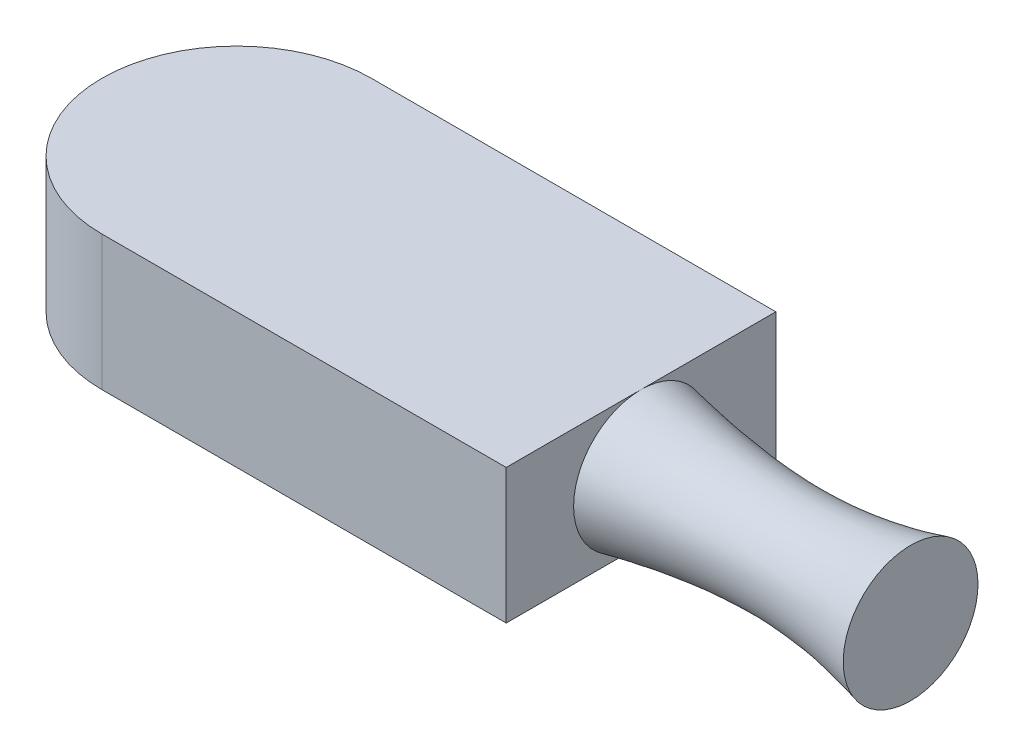
ISO-10303-21;
HEADER;
FILE_DESCRIPTION(('STEP AP214'),'2;1');
FILE_NAME('part.step','',(''),(''),'','','');
FILE_SCHEMA(('AUTOMOTIVE_DESIGN { 1 0 10303 214 1 1 1 1 }'));
ENDSEC;
DATA;
#1=APPLICATION_CONTEXT('core data for automotive mechanical design processes');
#2=APPLICATION_PROTOCOL_DEFINITION('international standard','automotive_design',2000,#1);
#3=PRODUCT_CONTEXT('',#1,'mechanical');
#4=PRODUCT('Part','Part','',(#3));
#5=PRODUCT_RELATED_PRODUCT_CATEGORY('part','',(#4));
#6=PRODUCT_DEFINITION_FORMATION('','',#4);
#7=PRODUCT_DEFINITION_CONTEXT('part definition',#1,'design');
#8=PRODUCT_DEFINITION('design','',#6,#7);
#9=PRODUCT_DEFINITION_SHAPE('','',#8);
#10=(LENGTH_UNIT() NAMED_UNIT(*) SI_UNIT(.MILLI.,.METRE.));
#11=(NAMED_UNIT(*) PLANE_ANGLE_UNIT() SI_UNIT($,.RADIAN.));
#12=(NAMED_UNIT(*) SI_UNIT($,.STERADIAN.) SOLID_ANGLE_UNIT());
#13=UNCERTAINTY_MEASURE_WITH_UNIT(LENGTH_MEASURE(1.E-05),#10,'distance_accuracy_value','');
#14=(GEOMETRIC_REPRESENTATION_CONTEXT(3) GLOBAL_UNCERTAINTY_ASSIGNED_CONTEXT((#13)) GLOBAL_UNIT_ASSIGNED_CONTEXT((#10,
#11,#12)) REPRESENTATION_CONTEXT('',''));
#15=CARTESIAN_POINT('',(0.,0.,0.));
#16=DIRECTION('',(0.,0.,1.));
#17=DIRECTION('',(1.,0.,0.));
#18=AXIS2_PLACEMENT_3D('',#15,#16,#17);
#19=CARTESIAN_POINT('',(38.1,25.4,0.));
#20=DIRECTION('',(-1.,0.,0.));
#21=DIRECTION('',(0.,0.,1.));
#22=AXIS2_PLACEMENT_3D('',#19,#20,#21);
#23=PLANE('',#22);
#24=DIRECTION('',(0.,0.,-1.));
#25=VECTOR('',#24,1.);
#26=CARTESIAN_POINT('',(38.1,0.,0.));
#27=LINE('',#26,#25);
#28=CARTESIAN_POINT('',(38.1,0.,25.4));
#29=VERTEX_POINT('',#28);
#30=CARTESIAN_POINT('',(38.1,0.000164924090044047,0.000815728203316317));
#31=VERTEX_POINT('',#30);
#32=EDGE_CURVE('E153',#29,#31,#27,.T.);
#33=ORIENTED_EDGE('',*,*,#32,.T.);
#34=CARTESIAN_POINT('',(38.1,12.7,0.));
#35=DIRECTION('',(1.,0.,0.));
#36=DIRECTION('',(0.,0.,-1.));
#37=AXIS2_PLACEMENT_3D('',#34,#35,#36);
#38=CIRCLE('',#37,12.7);
#39=CARTESIAN_POINT('',(38.1,25.3998352260934,-0.000815726641127512));
#40=VERTEX_POINT('',#39);
#41=EDGE_CURVE('E101',#40,#31,#38,.T.);
#42=ORIENTED_EDGE('',*,*,#41,.F.);
#43=DIRECTION('',(0.,0.,-1.));
#44=VECTOR('',#43,1.);
#45=CARTESIAN_POINT('',(38.1,25.4,0.));
#46=LINE('',#45,#44);
#47=CARTESIAN_POINT('',(38.1,25.4,25.4));
#48=VERTEX_POINT('',#47);
#49=EDGE_CURVE('E151',#48,#40,#46,.T.);
#50=ORIENTED_EDGE('',*,*,#49,.F.);
#51=DIRECTION('',(0.,-1.,0.));
#52=VECTOR('',#51,1.);
#53=CARTESIAN_POINT('',(38.1,25.4,25.4));
#54=LINE('',#53,#52);
#55=EDGE_CURVE('E194',#48,#29,#54,.T.);
#56=ORIENTED_EDGE('',*,*,#55,.T.);
#57=EDGE_LOOP('',(#33,#42,#50,#56));
#58=FACE_BOUND('',#57,.T.);
#59=ADVANCED_FACE('F81',(#58),#23,.F.);
#60=CARTESIAN_POINT('',(-38.1,25.4,0.));
#61=DIRECTION('',(0.,-1.,0.));
#62=DIRECTION('',(0.,0.,-1.));
#63=AXIS2_PLACEMENT_3D('',#60,#61,#62);
#64=CYLINDRICAL_SURFACE('',#63,25.4);
#65=CARTESIAN_POINT('',(-38.1,0.,0.));
#66=DIRECTION('',(0.,1.,0.));
#67=DIRECTION('',(0.,0.,1.));
#68=AXIS2_PLACEMENT_3D('',#65,#66,#67);
#69=CIRCLE('',#68,25.4);
#70=CARTESIAN_POINT('',(-38.1,0.,-25.4));
#71=VERTEX_POINT('',#70);
#72=CARTESIAN_POINT('',(-38.1,0.,25.4));
#73=VERTEX_POINT('',#72);
#74=EDGE_CURVE('E178',#71,#73,#69,.T.);
#75=ORIENTED_EDGE('',*,*,#74,.T.);
#76=DIRECTION('',(0.,-1.,0.));
#77=VECTOR('',#76,1.);
#78=CARTESIAN_POINT('',(-38.1,25.4,25.4));
#79=LINE('',#78,#77);
#80=CARTESIAN_POINT('',(-38.1,25.4,25.4));
#81=VERTEX_POINT('',#80);
#82=EDGE_CURVE('E95',#81,#73,#79,.T.);
#83=ORIENTED_EDGE('',*,*,#82,.F.);
#84=CARTESIAN_POINT('',(-38.1,25.4,0.));
#85=DIRECTION('',(0.,1.,0.));
#86=DIRECTION('',(0.,0.,1.));
#87=AXIS2_PLACEMENT_3D('',#84,#85,#86);
#88=CIRCLE('',#87,25.4);
#89=CARTESIAN_POINT('',(-38.1,25.4,-25.4));
#90=VERTEX_POINT('',#89);
#91=EDGE_CURVE('E191',#90,#81,#88,.T.);
#92=ORIENTED_EDGE('',*,*,#91,.F.);
#93=DIRECTION('',(0.,-1.,0.));
#94=VECTOR('',#93,1.);
#95=CARTESIAN_POINT('',(-38.1,25.4,-25.4));
#96=LINE('',#95,#94);
#97=EDGE_CURVE('E110',#90,#71,#96,.T.);
#98=ORIENTED_EDGE('',*,*,#97,.T.);
#99=EDGE_LOOP('',(#75,#83,#92,#98));
#100=FACE_BOUND('',#99,.T.);
#101=ADVANCED_FACE('F83',(#100),#64,.T.);
#102=CARTESIAN_POINT('',(0.,25.4,25.4));
#103=DIRECTION('',(0.,0.,-1.));
#104=DIRECTION('',(-1.,0.,0.));
#105=AXIS2_PLACEMENT_3D('',#102,#103,#104);
#106=PLANE('',#105);
#107=DIRECTION('',(1.,0.,0.));
#108=VECTOR('',#107,1.);
#109=CARTESIAN_POINT('',(0.,0.,25.4));
#110=LINE('',#109,#108);
#111=EDGE_CURVE('E180',#73,#29,#110,.T.);
#112=ORIENTED_EDGE('',*,*,#111,.T.);
#113=ORIENTED_EDGE('',*,*,#55,.F.);
#114=DIRECTION('',(1.,0.,0.));
#115=VECTOR('',#114,1.);
#116=CARTESIAN_POINT('',(0.,25.4,25.4));
#117=LINE('',#116,#115);
#118=EDGE_CURVE('E137',#81,#48,#117,.T.);
#119=ORIENTED_EDGE('',*,*,#118,.F.);
#120=ORIENTED_EDGE('',*,*,#82,.T.);
#121=EDGE_LOOP('',(#112,#113,#119,#120));
#122=FACE_BOUND('',#121,.T.);
#123=ADVANCED_FACE('F199',(#122),#106,.F.);
#124=CARTESIAN_POINT('',(38.1,25.4,-25.4));
#125=VERTEX_POINT('',#124);
#126=EDGE_CURVE('E158',#40,#125,#46,.T.);
#127=ORIENTED_EDGE('',*,*,#126,.F.);
#128=CARTESIAN_POINT('',(38.0999999999999,25.3996704428553,-0.000815674937197479));
#129=CARTESIAN_POINT('',(38.1,25.3996066486588,-0.202913376100319));
#130=CARTESIAN_POINT('',(38.1,25.3947481057519,-0.405009517367538));
#131=CARTESIAN_POINT('',(38.1,25.3754574167251,-0.808751665281319));
#132=CARTESIAN_POINT('',(38.1,25.361024923713,-1.01039765535195));
#133=CARTESIAN_POINT('',(38.1,25.3226037702186,-1.41276170348465));
#134=CARTESIAN_POINT('',(38.1,25.298615873159,-1.61347983438177));
#135=CARTESIAN_POINT('',(38.1,25.2411012493836,-2.01354080108224));
#136=CARTESIAN_POINT('',(38.1,25.2075746812541,-2.21288365969394));
#137=CARTESIAN_POINT('',(38.1,25.1310680678409,-2.60934790581265));
#138=CARTESIAN_POINT('',(38.1,25.088106694036,-2.80647288369062));
#139=CARTESIAN_POINT('',(38.1,24.9927340025499,-3.19840569838486));
#140=CARTESIAN_POINT('',(38.1,24.940322593387,-3.39321351275022));
#141=CARTESIAN_POINT('',(38.1,24.769221088842,-3.97348757581742));
#142=CARTESIAN_POINT('',(38.1,24.6366328501715,-4.35496381855234));
#143=CARTESIAN_POINT('',(38.1,24.353249994578,-5.06067306140083));
#144=CARTESIAN_POINT('',(38.1,24.2062795417913,-5.38645837692749));
#145=CARTESIAN_POINT('',(38.1,23.8855897684626,-6.02458102020995));
#146=CARTESIAN_POINT('',(38.1,23.7118731469682,-6.33691970084663));
#147=CARTESIAN_POINT('',(38.1,23.3387760659615,-6.94572018129846));
#148=CARTESIAN_POINT('',(38.1,23.1394051144208,-7.2421878058666));
#149=CARTESIAN_POINT('',(38.1,22.7160929284025,-7.81703614059032));
#150=CARTESIAN_POINT('',(38.1000000000001,22.4921513016699,-8.09541656188223));
#151=CARTESIAN_POINT('',(38.1000000000001,22.0218789588709,-8.63209895757966));
#152=CARTESIAN_POINT('',(38.1,21.7755695207335,-8.89041958916134));
#153=CARTESIAN_POINT('',(38.1,21.2622312470849,-9.38557714913558));
#154=CARTESIAN_POINT('',(38.1,20.9952018093197,-9.62241345262358));
#155=CARTESIAN_POINT('',(38.1,20.4421417911485,-10.0729990995825));
#156=CARTESIAN_POINT('',(38.1,20.1561060460419,-10.2867421259988));
#157=CARTESIAN_POINT('',(38.1,19.7143653654544,-10.5886212538229));
#158=CARTESIAN_POINT('',(38.1,19.5649910925558,-10.6861323451511));
#159=CARTESIAN_POINT('',(38.1,19.2622249541605,-10.874703884932));
#160=CARTESIAN_POINT('',(38.1,19.1088330922936,-10.9657643392127));
#161=CARTESIAN_POINT('',(38.1,18.6425201484366,-11.2293893038699));
#162=CARTESIAN_POINT('',(38.1,18.3239392739334,-11.3920712460135));
#163=CARTESIAN_POINT('',(38.1,17.6742710345171,-11.690120888392));
#164=CARTESIAN_POINT('',(38.1,17.3431825995161,-11.8254862452367));
#165=CARTESIAN_POINT('',(38.1,16.6708536303209,-12.0680152339755));
#166=CARTESIAN_POINT('',(38.1,16.3296140146357,-12.1751814088285));
#167=CARTESIAN_POINT('',(38.1,15.6393572356093,-12.3604381178517));
#168=CARTESIAN_POINT('',(38.1000000000001,15.2903407949923,-12.4385313420153));
#169=CARTESIAN_POINT('',(38.1000000000001,14.5865419011062,-12.5647147886061));
#170=CARTESIAN_POINT('',(38.1,14.2317537750473,-12.6127734022006));
#171=CARTESIAN_POINT('',(38.1,13.519364931522,-12.6786792623036));
#172=CARTESIAN_POINT('',(38.1,13.1617639826887,-12.6965239969224));
#173=CARTESIAN_POINT('',(38.1,12.4463240497424,-12.7021571734447));
#174=CARTESIAN_POINT('',(38.1,12.0884850621326,-12.6899451636185));
#175=CARTESIAN_POINT('',(38.1,11.3751078163937,-12.6355618336902));
#176=CARTESIAN_POINT('',(38.1,11.0195694329149,-12.5933921599556));
#177=CARTESIAN_POINT('',(38.1,10.313741785242,-12.4792256287415));
#178=CARTESIAN_POINT('',(38.1,9.96344671587475,-12.4072647485973));
#179=CARTESIAN_POINT('',(38.1,9.27026931102974,-12.2337240385799));
#180=CARTESIAN_POINT('',(38.1,8.92738709288603,-12.1321437402452));
#181=CARTESIAN_POINT('',(38.1,8.2514041768775,-11.9005198242328));
#182=CARTESIAN_POINT('',(38.1,7.9183029661525,-11.7704777019643));
#183=CARTESIAN_POINT('',(38.1,7.26415645901603,-11.4829735142019));
#184=CARTESIAN_POINT('',(38.1,6.94311143814598,-11.3255108224804));
#185=CARTESIAN_POINT('',(38.1,6.31555172425616,-10.9843034601806));
#186=CARTESIAN_POINT('',(38.1,6.00902647867663,-10.8005782790713));
#187=CARTESIAN_POINT('',(38.1,5.56180434717338,-10.5060824385823));
#188=CARTESIAN_POINT('',(38.1,5.41481278056378,-10.4047565134222));
#189=CARTESIAN_POINT('',(38.1,5.12528945069728,-10.1959217370406));
#190=CARTESIAN_POINT('',(38.1,4.98275768577455,-10.0884128881287));
#191=CARTESIAN_POINT('',(38.1,4.56224303688711,-9.75700095248963));
#192=CARTESIAN_POINT('',(38.1,4.29123679912454,-9.52414392755239));
#193=CARTESIAN_POINT('',(38.1,3.76971620348353,-9.03654728761646));
#194=CARTESIAN_POINT('',(38.1,3.51920350189633,-8.78180590732458));
#195=CARTESIAN_POINT('',(38.1,3.04059557799481,-8.25252936784889));
#196=CARTESIAN_POINT('',(38.1,2.81247762652498,-7.97801477831407));
#197=CARTESIAN_POINT('',(38.1,2.38009027900863,-7.41083168384099));
#198=CARTESIAN_POINT('',(38.1,2.17581891968809,-7.11816467642142));
#199=CARTESIAN_POINT('',(38.1,1.79283265684639,-6.51634682237808));
#200=CARTESIAN_POINT('',(38.1,1.61413081291858,-6.20718766228811));
#201=CARTESIAN_POINT('',(38.1,1.28344175522118,-5.57489391880717));
#202=CARTESIAN_POINT('',(38.1000000000001,1.13145566219974,-5.25175874981915));
#203=CARTESIAN_POINT('',(38.1000000000001,0.854960667297845,-4.59372238519691));
#204=CARTESIAN_POINT('',(38.1,0.73046780841875,-4.25881445127334));
#205=CARTESIAN_POINT('',(38.1,0.509930583704949,-3.57971315856796));
#206=CARTESIAN_POINT('',(38.1,0.41388916740969,-3.23551884110664));
#207=CARTESIAN_POINT('',(38.1,0.2513436415092,-2.54089044598912));
#208=CARTESIAN_POINT('',(38.1,0.184786093552212,-2.19046886444152));
#209=CARTESIAN_POINT('',(38.1,0.081759670512506,-1.48538170587364));
#210=CARTESIAN_POINT('',(38.1,0.045273318702744,-1.13071871564286));
#211=CARTESIAN_POINT('',(38.1,0.0158703964262496,-0.645994130726347));
#212=CARTESIAN_POINT('',(38.1,0.0100029165092976,-0.51661638050932));
#213=CARTESIAN_POINT('',(38.1,0.00221524772106838,-0.257891935829001));
#214=CARTESIAN_POINT('',(38.1,0.000290499159893829,-0.128545378661662));
#215=CARTESIAN_POINT('',(38.1,0.00032985751240655,0.000815677812366548));
#216=B_SPLINE_CURVE_WITH_KNOTS('',3,(#128,#129,#130,#131,#132,#133,#134,#135,#136,#137,#138,
#139,#140,#141,#142,#143,#144,#145,#146,#147,#148,#149,#150,#151,#152,#153,#154,#155,#156,#157,
#158,#159,#160,#161,#162,#163,#164,#165,#166,#167,#168,#169,#170,#171,#172,#173,#174,#175,#176,
#177,#178,#179,#180,#181,#182,#183,#184,#185,#186,#187,#188,#189,#190,#191,#192,#193,#194,#195,
#196,#197,#198,#199,#200,#201,#202,#203,#204,#205,#206,#207,#208,#209,#210,#211,#212,#213,#214,
#215),.UNSPECIFIED.,.F.,.F.,(4,2,2,2,2,2,2,2,2,2,2,2,2,2,2,2,2,2,2,2,2,2,2,2,2,2,2,2,2,2,2,2,2,
2,2,2,2,2,2,2,2,2,2,4),(0.,0.606236308706906,1.21249458432875,1.81870443305675,2.42490420375325,
3.02991494581151,3.63493154502775,4.8444797160082,5.91550302414146,6.98641832239348,
8.05693785658072,9.12747448341772,10.1970031955846,11.2665630066619,12.3364146538525,
12.8714289132123,13.4064426892013,14.4781995388123,15.5500482914833,16.6218003533279,
17.6934532259692,18.7662320297928,19.8391000167911,20.9119841282641,21.9848092823691,
23.056342601703,24.1278928693587,25.199386850339,26.2709053051797,27.3416326719611,
27.8770862650645,28.4125396581633,29.4830739892486,30.5536947558071,31.6232174305619,
32.6926519900382,33.7626308267249,34.8326545392141,35.9033009975636,36.9740584102078,
38.0428670964111,39.1110541752863,39.4995416605508,39.8875796135859),.UNSPECIFIED.);
#217=EDGE_CURVE('E12',#40,#31,#216,.T.);
#218=ORIENTED_EDGE('',*,*,#217,.T.);
#219=CARTESIAN_POINT('',(38.1,0.,-25.4));
#220=VERTEX_POINT('',#219);
#221=EDGE_CURVE('E182',#31,#220,#27,.T.);
#222=ORIENTED_EDGE('',*,*,#221,.T.);
#223=DIRECTION('',(0.,-1.,0.));
#224=VECTOR('',#223,1.);
#225=CARTESIAN_POINT('',(38.1,25.4,-25.4));
#226=LINE('',#225,#224);
#227=EDGE_CURVE('E161',#125,#220,#226,.T.);
#228=ORIENTED_EDGE('',*,*,#227,.F.);
#229=EDGE_LOOP('',(#127,#218,#222,#228));
#230=FACE_BOUND('',#229,.T.);
#231=ADVANCED_FACE('F159',(#230),#23,.F.);
#232=CARTESIAN_POINT('',(0.,25.4,-25.4));
#233=DIRECTION('',(0.,0.,-1.));
#234=DIRECTION('',(-1.,0.,0.));
#235=AXIS2_PLACEMENT_3D('',#232,#233,#234);
#236=PLANE('',#235);
#237=DIRECTION('',(1.,0.,0.));
#238=VECTOR('',#237,1.);
#239=CARTESIAN_POINT('',(0.,0.,-25.4));
#240=LINE('',#239,#238);
#241=EDGE_CURVE('E185',#71,#220,#240,.T.);
#242=ORIENTED_EDGE('',*,*,#241,.F.);
#243=ORIENTED_EDGE('',*,*,#97,.F.);
#244=DIRECTION('',(1.,0.,0.));
#245=VECTOR('',#244,1.);
#246=CARTESIAN_POINT('',(0.,25.4,-25.4));
#247=LINE('',#246,#245);
#248=EDGE_CURVE('E166',#90,#125,#247,.T.);
#249=ORIENTED_EDGE('',*,*,#248,.T.);
#250=ORIENTED_EDGE('',*,*,#227,.T.);
#251=EDGE_LOOP('',(#242,#243,#249,#250));
#252=FACE_BOUND('',#251,.T.);
#253=ADVANCED_FACE('F193',(#252),#236,.T.);
#254=CARTESIAN_POINT('',(0.,25.4,0.));
#255=DIRECTION('',(0.,1.,0.));
#256=DIRECTION('',(0.,0.,1.));
#257=AXIS2_PLACEMENT_3D('',#254,#255,#256);
#258=PLANE('',#257);
#259=ORIENTED_EDGE('',*,*,#91,.T.);
#260=ORIENTED_EDGE('',*,*,#118,.T.);
#261=ORIENTED_EDGE('',*,*,#49,.T.);
#262=ORIENTED_EDGE('',*,*,#126,.T.);
#263=ORIENTED_EDGE('',*,*,#248,.F.);
#264=EDGE_LOOP('',(#259,#260,#261,#262,#263));
#265=FACE_BOUND('',#264,.T.);
#266=ADVANCED_FACE('F165',(#265),#258,.T.);
#267=CARTESIAN_POINT('',(0.,0.,0.));
#268=DIRECTION('',(0.,1.,0.));
#269=DIRECTION('',(0.,0.,1.));
#270=AXIS2_PLACEMENT_3D('',#267,#268,#269);
#271=PLANE('',#270);
#272=ORIENTED_EDGE('',*,*,#74,.F.);
#273=ORIENTED_EDGE('',*,*,#241,.T.);
#274=ORIENTED_EDGE('',*,*,#221,.F.);
#275=ORIENTED_EDGE('',*,*,#32,.F.);
#276=ORIENTED_EDGE('',*,*,#111,.F.);
#277=EDGE_LOOP('',(#272,#273,#274,#275,#276));
#278=FACE_BOUND('',#277,.T.);
#279=ADVANCED_FACE('F196',(#278),#271,.F.);
#280=CARTESIAN_POINT('',(88.9,12.7,0.));
#281=DIRECTION('',(1.,0.,0.));
#282=DIRECTION('',(0.,0.,-1.));
#283=AXIS2_PLACEMENT_3D('',#280,#281,#282);
#284=PLANE('',#283);
#285=CARTESIAN_POINT('',(88.9,12.7,0.));
#286=DIRECTION('',(1.,0.,0.));
#287=DIRECTION('',(0.,0.,-1.));
#288=AXIS2_PLACEMENT_3D('',#285,#286,#287);
#289=CIRCLE('',#288,12.7);
#290=CARTESIAN_POINT('',(88.9,12.7,-12.7));
#291=VERTEX_POINT('',#290);
#292=EDGE_CURVE('E154',#291,#291,#289,.T.);
#293=ORIENTED_EDGE('',*,*,#292,.T.);
#294=EDGE_LOOP('',(#293));
#295=FACE_BOUND('',#294,.T.);
#296=ADVANCED_FACE('F215',(#295),#284,.T.);
#297=CARTESIAN_POINT('',(38.1,19.3561312695833,-10.8160027978027));
#298=CARTESIAN_POINT('',(46.6275733472348,18.117911659557,-9.5170545116901));
#299=CARTESIAN_POINT('',(63.6806582867568,15.2209304345255,-8.46421797816333));
#300=CARTESIAN_POINT('',(80.4942400139015,11.5285766471072,-10.4950189467063));
#301=CARTESIAN_POINT('',(88.9,9.47212875090853,-12.282949450327));
#302=CARTESIAN_POINT('',(38.1,20.7719426393336,-9.94471730479775));
#303=CARTESIAN_POINT('',(46.6275716404865,19.3636946098074,-8.80783986620953));
#304=CARTESIAN_POINT('',(63.6806599936789,16.3288874908063,-8.13422104371846));
#305=CARTESIAN_POINT('',(80.4942383071531,12.9023807495492,-10.6483860376017));
#306=CARTESIAN_POINT('',(88.9,11.0799629768181,-12.7054767832048));
#307=CARTESIAN_POINT('',(38.1000000000001,23.2569088305093,-7.63985575065806));
#308=CARTESIAN_POINT('',(46.6275751791548,21.5730169473672,-6.89472562063252));
#309=CARTESIAN_POINT('',(63.6806564546503,18.4132846408225,-7.03422372455075));
#310=CARTESIAN_POINT('',(80.4942418458214,15.7104130069792,-10.4091545383922));
#311=CARTESIAN_POINT('',(88.9,14.4630070374963,-12.9115268706798));
#312=CARTESIAN_POINT('',(38.1,25.3766928887343,-3.01801063603366));
#313=CARTESIAN_POINT('',(46.6275793635323,23.5358805124229,-2.97392204926547));
#314=CARTESIAN_POINT('',(63.6806522698473,20.670154175395,-4.31189690803263));
#315=CARTESIAN_POINT('',(80.4942460301989,19.4646842847993,-8.46431592787116));
#316=CARTESIAN_POINT('',(88.9,19.2698974439998,-11.2535940201263));
#317=CARTESIAN_POINT('',(38.1,25.5668047197692,2.0626916075049));
#318=CARTESIAN_POINT('',(46.6275775010547,23.849253237563,1.39895000366513));
#319=CARTESIAN_POINT('',(63.6806541325143,21.7136685286558,-0.933872811125934));
#320=CARTESIAN_POINT('',(80.4942441677212,22.1889207305993,-5.23150719738819));
#321=CARTESIAN_POINT('',(88.8999999999999,23.0763062549513,-7.88299618595653));
#322=CARTESIAN_POINT('',(38.1000000000001,23.7979524174008,6.829690380475));
#323=CARTESIAN_POINT('',(46.6275772255515,22.4651373618147,5.55918395963246));
#324=CARTESIAN_POINT('',(63.6806544080452,21.384855158609,2.58667534685951));
#325=CARTESIAN_POINT('',(80.4942438922184,23.4686185312177,-1.20193097259306));
#326=CARTESIAN_POINT('',(88.9000000000001,25.303174092294,-3.31198148415341));
#327=CARTESIAN_POINT('',(38.1,20.3396013810419,10.5567655261092));
#328=CARTESIAN_POINT('',(46.6275777738006,19.594450108751,8.87294481997831));
#329=CARTESIAN_POINT('',(63.6806538597405,19.7339285609122,5.71331718547144));
#330=CARTESIAN_POINT('',(80.4942444404673,23.1088808900919,3.01049595646686));
#331=CARTESIAN_POINT('',(88.9,25.6112475742705,1.76309208788405));
#332=CARTESIAN_POINT('',(38.1,15.7181469225478,12.6767408843745));
#333=CARTESIAN_POINT('',(46.6275740350567,15.674097839878,10.8358826667399));
#334=CARTESIAN_POINT('',(63.6806575988651,17.012111682574,7.97009118526161));
#335=CARTESIAN_POINT('',(80.4942407017234,21.1644817891664,6.76461005221826));
#336=CARTESIAN_POINT('',(88.9,23.9537228408224,6.56983200071407));
#337=CARTESIAN_POINT('',(38.1,10.6372790307642,12.8668145581128));
#338=CARTESIAN_POINT('',(46.6275806765461,11.3009912397407,11.149261127405));
#339=CARTESIAN_POINT('',(63.6806509566994,13.6337861483659,9.01367794513035));
#340=CARTESIAN_POINT('',(80.4942473432127,17.9314605708924,9.48894095302297));
#341=CARTESIAN_POINT('',(88.8999999999999,20.5829830289063,10.3763342870093));
#342=CARTESIAN_POINT('',(38.0999999999999,5.87036902690964,11.0979343286796));
#343=CARTESIAN_POINT('',(46.6275769170244,7.14086575644728,9.76512454294644));
#344=CARTESIAN_POINT('',(63.6806547166043,10.1133595375184,8.68484092649118));
#345=CARTESIAN_POINT('',(80.4942435836913,13.9019593512727,10.7685807437713));
#346=CARTESIAN_POINT('',(88.9000000000002,16.0120094191477,12.6031186299168));
#347=CARTESIAN_POINT('',(38.1000000000001,2.1431645737867,7.63956546235698));
#348=CARTESIAN_POINT('',(46.6275746816077,3.82702376344748,6.8944335572862));
#349=CARTESIAN_POINT('',(63.6806569522479,6.98669048836395,7.03394305209315));
#350=CARTESIAN_POINT('',(80.4942413482743,9.68946982567314,10.4089054664496));
#351=CARTESIAN_POINT('',(88.8999999999999,10.9368336657107,12.9112733356327));
#352=CARTESIAN_POINT('',(38.0999999999999,0.0232628762407011,3.0181627177405));
#353=CARTESIAN_POINT('',(46.6275800366887,1.86409122214814,2.97406097577792));
#354=CARTESIAN_POINT('',(63.6806515966223,4.72985245249984,4.31201802255888));
#355=CARTESIAN_POINT('',(80.4942467033555,5.93537064848787,8.46443987390692));
#356=CARTESIAN_POINT('',(88.9000000000001,6.13018202140825,11.2537310268119));
#357=CARTESIAN_POINT('',(38.1000000000001,-0.166768343447337,-2.06278453322843));
#358=CARTESIAN_POINT('',(46.6275772666563,1.55077327654869,-1.39903272089718));
#359=CARTESIAN_POINT('',(63.6806543669365,3.68633544332709,0.933801291477284));
#360=CARTESIAN_POINT('',(80.4942439333229,3.21105328234284,5.23142734583147));
#361=CARTESIAN_POINT('',(88.8999999999999,2.32365164402659,7.88290570982255));
#362=CARTESIAN_POINT('',(38.1,1.60200448636447,-6.82962035045663));
#363=CARTESIAN_POINT('',(46.6275771885381,2.93482751425458,-5.55912205218535));
#364=CARTESIAN_POINT('',(63.6806544450628,4.01512834749155,-2.58661997958567));
#365=CARTESIAN_POINT('',(80.4942438552046,1.93138900860283,1.20199921203439));
#366=CARTESIAN_POINT('',(88.8999999999999,0.0968468070980687,3.31206101216312));
#367=CARTESIAN_POINT('',(38.1,5.06046518263925,-10.5568398746348));
#368=CARTESIAN_POINT('',(46.6275781680307,5.80560737701356,-8.87301055783899));
#369=CARTESIAN_POINT('',(63.6806534654704,5.66610720318157,-5.71337907049595));
#370=CARTESIAN_POINT('',(80.4942448346976,2.29112718987278,-3.01057968465376));
#371=CARTESIAN_POINT('',(88.9000000000003,-0.211255393699501,-1.76319157297547));
#372=CARTESIAN_POINT('',(38.1,9.6817372458868,-12.6766328629346));
#373=CARTESIAN_POINT('',(46.627572757534,9.72579866538946,-10.8357855574454));
#374=CARTESIAN_POINT('',(63.6806588765175,8.3878170937145,-7.96999450069305));
#375=CARTESIAN_POINT('',(80.4942394242006,4.23548997765933,-6.76447444436629));
#376=CARTESIAN_POINT('',(88.8999999999997,1.44627531759073,-6.56967362713185));
#377=CARTESIAN_POINT('',(38.1,14.7629470349457,-12.8670108990999));
#378=CARTESIAN_POINT('',(46.6275854196451,14.0992256688031,-11.1494556839281));
#379=CARTESIAN_POINT('',(63.6806462131183,11.7663829829374,-9.0138955827034));
#380=CARTESIAN_POINT('',(80.4942520863118,7.46861775107832,-9.48922250113599));
#381=CARTESIAN_POINT('',(88.9000000000001,4.81703104078962,-10.3766333815296));
#382=CARTESIAN_POINT('',(38.1,17.9403198998329,-11.6872882908077));
#383=CARTESIAN_POINT('',(46.6275750539832,16.8721287093066,-10.2262691571707));
#384=CARTESIAN_POINT('',(63.6806565798347,14.1129733782447,-8.79421491260821));
#385=CARTESIAN_POINT('',(80.4942417206499,10.1547725446652,-10.3416518558109));
#386=CARTESIAN_POINT('',(88.9,7.86429452499891,-11.8604221174493));
#387=CARTESIAN_POINT('',(38.1,19.3561312695833,-10.8160027978027));
#388=CARTESIAN_POINT('',(46.6275733472348,18.117911659557,-9.5170545116901));
#389=CARTESIAN_POINT('',(63.6806582867568,15.2209304345255,-8.46421797816333));
#390=CARTESIAN_POINT('',(80.4942400139015,11.5285766471072,-10.4950189467063));
#391=CARTESIAN_POINT('',(88.9,9.47212875090853,-12.282949450327));
#392=B_SPLINE_SURFACE_WITH_KNOTS('',3,3,((#297,#298,#299,#300,#301),(#302,#303,#304,#305,#306),
(#307,#308,#309,#310,#311),(#312,#313,#314,#315,#316),(#317,#318,#319,#320,#321),(#322,#323,
#324,#325,#326),(#327,#328,#329,#330,#331),(#332,#333,#334,#335,#336),(#337,#338,#339,#340,
#341),(#342,#343,#344,#345,#346),(#347,#348,#349,#350,#351),(#352,#353,#354,#355,#356),(#357,
#358,#359,#360,#361),(#362,#363,#364,#365,#366),(#367,#368,#369,#370,#371),(#372,#373,#374,#375,
#376),(#377,#378,#379,#380,#381),(#382,#383,#384,#385,#386),(#387,#388,#389,#390,#391)),
.UNSPECIFIED.,.T.,.F.,.F.,(4,1,1,1,1,1,1,1,1,1,1,1,1,1,1,1,4),(4,1,4),(0.,0.0625,0.125,0.1875,
0.25,0.3125,0.375,0.4375,0.5,0.5625,0.625,0.6875,0.75,0.8125,0.875,0.9375,1.),(0.,
0.496433678026446,1.),.UNSPECIFIED.);
#393=ORIENTED_EDGE('',*,*,#41,.T.);
#394=ORIENTED_EDGE('',*,*,#217,.F.);
#395=EDGE_LOOP('',(#393,#394));
#396=FACE_BOUND('',#395,.T.);
#397=ORIENTED_EDGE('',*,*,#292,.F.);
#398=EDGE_LOOP('',(#397));
#399=FACE_BOUND('',#398,.T.);
#400=ADVANCED_FACE('F140',(#396,#399),#392,.T.);
#401=CLOSED_SHELL('',(#59,#101,#123,#231,#253,#266,#279,#296,#400));
#402=MANIFOLD_SOLID_BREP('B2',#401);
#403=ADVANCED_BREP_SHAPE_REPRESENTATION('',(#18,#402),#14);
#404=SHAPE_DEFINITION_REPRESENTATION(#9,#403);
ENDSEC;
END-ISO-10303-21;
